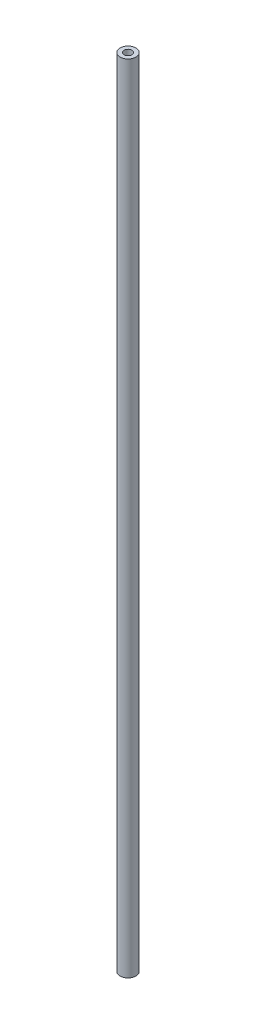
ISO-10303-21;
HEADER;
FILE_DESCRIPTION(('STEP AP214'),'2;1');
FILE_NAME('part.step','',(''),(''),'','','');
FILE_SCHEMA(('AUTOMOTIVE_DESIGN { 1 0 10303 214 1 1 1 1 }'));
ENDSEC;
DATA;
#1=APPLICATION_CONTEXT('core data for automotive mechanical design processes');
#2=APPLICATION_PROTOCOL_DEFINITION('international standard','automotive_design',2000,#1);
#3=PRODUCT_CONTEXT('',#1,'mechanical');
#4=PRODUCT('Part','Part','',(#3));
#5=PRODUCT_RELATED_PRODUCT_CATEGORY('part','',(#4));
#6=PRODUCT_DEFINITION_FORMATION('','',#4);
#7=PRODUCT_DEFINITION_CONTEXT('part definition',#1,'design');
#8=PRODUCT_DEFINITION('design','',#6,#7);
#9=PRODUCT_DEFINITION_SHAPE('','',#8);
#10=(LENGTH_UNIT() NAMED_UNIT(*) SI_UNIT(.MILLI.,.METRE.));
#11=(NAMED_UNIT(*) PLANE_ANGLE_UNIT() SI_UNIT($,.RADIAN.));
#12=(NAMED_UNIT(*) SI_UNIT($,.STERADIAN.) SOLID_ANGLE_UNIT());
#13=UNCERTAINTY_MEASURE_WITH_UNIT(LENGTH_MEASURE(1.E-05),#10,'distance_accuracy_value','');
#14=(GEOMETRIC_REPRESENTATION_CONTEXT(3) GLOBAL_UNCERTAINTY_ASSIGNED_CONTEXT((#13)) GLOBAL_UNIT_ASSIGNED_CONTEXT((#10,
#11,#12)) REPRESENTATION_CONTEXT('',''));
#15=CARTESIAN_POINT('',(0.,0.,0.));
#16=DIRECTION('',(0.,0.,1.));
#17=DIRECTION('',(1.,0.,0.));
#18=AXIS2_PLACEMENT_3D('',#15,#16,#17);
#19=CARTESIAN_POINT('',(-1.99999999999996,0.,0.));
#20=DIRECTION('',(0.,1.,0.));
#21=DIRECTION('',(0.,0.,1.));
#22=AXIS2_PLACEMENT_3D('',#19,#20,#21);
#23=PLANE('',#22);
#24=CARTESIAN_POINT('',(0.,0.,0.));
#25=DIRECTION('',(0.,-1.,0.));
#26=DIRECTION('',(0.,0.,-1.));
#27=AXIS2_PLACEMENT_3D('',#24,#25,#26);
#28=CIRCLE('',#27,0.999999999999927);
#29=CARTESIAN_POINT('',(0.,0.,-0.999999999999927));
#30=VERTEX_POINT('',#29);
#31=EDGE_CURVE('E10',#30,#30,#28,.T.);
#32=ORIENTED_EDGE('',*,*,#31,.F.);
#33=EDGE_LOOP('',(#32));
#34=FACE_BOUND('',#33,.T.);
#35=CARTESIAN_POINT('',(0.,0.,0.));
#36=DIRECTION('',(0.,-1.,0.));
#37=DIRECTION('',(0.,0.,-1.));
#38=AXIS2_PLACEMENT_3D('',#35,#36,#37);
#39=CIRCLE('',#38,1.99999999999996);
#40=CARTESIAN_POINT('',(0.,0.,-1.99999999999996));
#41=VERTEX_POINT('',#40);
#42=EDGE_CURVE('E45',#41,#41,#39,.T.);
#43=ORIENTED_EDGE('',*,*,#42,.T.);
#44=EDGE_LOOP('',(#43));
#45=FACE_BOUND('',#44,.T.);
#46=ADVANCED_FACE('F31',(#34,#45),#23,.F.);
#47=CARTESIAN_POINT('',(0.,0.,0.));
#48=DIRECTION('',(0.,-1.,0.));
#49=DIRECTION('',(0.,0.,-1.));
#50=AXIS2_PLACEMENT_3D('',#47,#48,#49);
#51=CYLINDRICAL_SURFACE('',#50,0.999999999999927);
#52=CARTESIAN_POINT('',(0.,200.,0.));
#53=DIRECTION('',(0.,-1.,0.));
#54=DIRECTION('',(0.,0.,-1.));
#55=AXIS2_PLACEMENT_3D('',#52,#53,#54);
#56=CIRCLE('',#55,0.999999999999927);
#57=CARTESIAN_POINT('',(0.,200.,-0.999999999999927));
#58=VERTEX_POINT('',#57);
#59=EDGE_CURVE('E37',#58,#58,#56,.T.);
#60=ORIENTED_EDGE('',*,*,#59,.F.);
#61=EDGE_LOOP('',(#60));
#62=FACE_BOUND('',#61,.T.);
#63=ORIENTED_EDGE('',*,*,#31,.T.);
#64=EDGE_LOOP('',(#63));
#65=FACE_BOUND('',#64,.T.);
#66=ADVANCED_FACE('F60',(#62,#65),#51,.F.);
#67=CARTESIAN_POINT('',(-0.999999999999927,200.,0.));
#68=DIRECTION('',(0.,-1.,0.));
#69=DIRECTION('',(0.,0.,-1.));
#70=AXIS2_PLACEMENT_3D('',#67,#68,#69);
#71=PLANE('',#70);
#72=CARTESIAN_POINT('',(0.,200.,0.));
#73=DIRECTION('',(0.,-1.,0.));
#74=DIRECTION('',(0.,0.,-1.));
#75=AXIS2_PLACEMENT_3D('',#72,#73,#74);
#76=CIRCLE('',#75,2.00000000000001);
#77=CARTESIAN_POINT('',(0.,200.,-2.00000000000001));
#78=VERTEX_POINT('',#77);
#79=EDGE_CURVE('E41',#78,#78,#76,.T.);
#80=ORIENTED_EDGE('',*,*,#79,.F.);
#81=EDGE_LOOP('',(#80));
#82=FACE_BOUND('',#81,.T.);
#83=ORIENTED_EDGE('',*,*,#59,.T.);
#84=EDGE_LOOP('',(#83));
#85=FACE_BOUND('',#84,.T.);
#86=ADVANCED_FACE('F55',(#82,#85),#71,.F.);
#87=CARTESIAN_POINT('',(0.,0.,0.));
#88=DIRECTION('',(0.,-1.,0.));
#89=DIRECTION('',(0.,0.,-1.));
#90=AXIS2_PLACEMENT_3D('',#87,#88,#89);
#91=CYLINDRICAL_SURFACE('',#90,1.99999999999998);
#92=ORIENTED_EDGE('',*,*,#42,.F.);
#93=EDGE_LOOP('',(#92));
#94=FACE_BOUND('',#93,.T.);
#95=ORIENTED_EDGE('',*,*,#79,.T.);
#96=EDGE_LOOP('',(#95));
#97=FACE_BOUND('',#96,.T.);
#98=ADVANCED_FACE('F52',(#94,#97),#91,.T.);
#99=CLOSED_SHELL('',(#46,#66,#86,#98));
#100=MANIFOLD_SOLID_BREP('B2',#99);
#101=ADVANCED_BREP_SHAPE_REPRESENTATION('',(#18,#100),#14);
#102=SHAPE_DEFINITION_REPRESENTATION(#9,#101);
ENDSEC;
END-ISO-10303-21;
